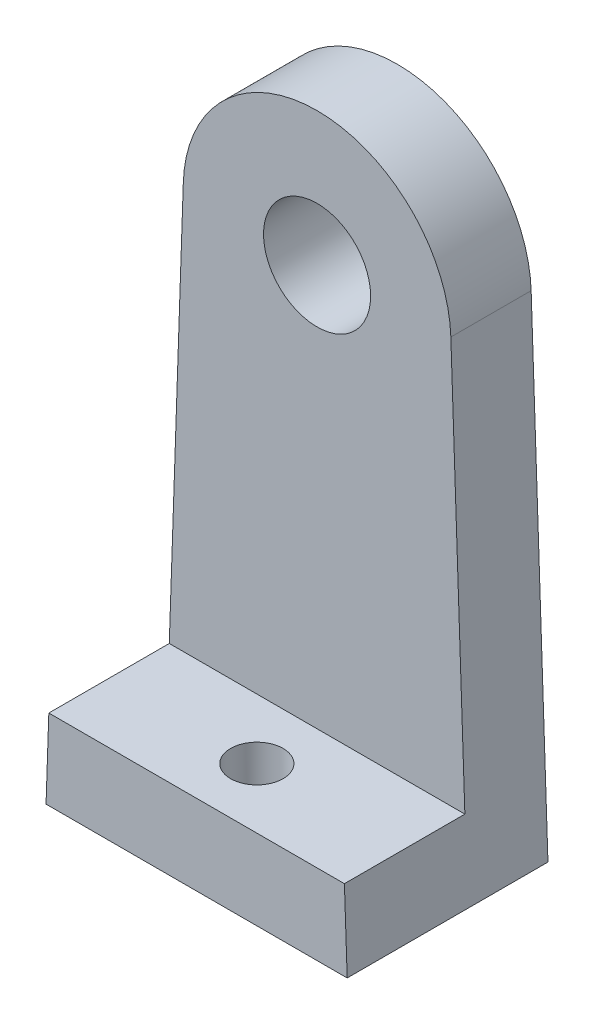
ISO-10303-21;
HEADER;
FILE_DESCRIPTION(('STEP AP214'),'2;1');
FILE_NAME('part.step','',(''),(''),'','','');
FILE_SCHEMA(('AUTOMOTIVE_DESIGN { 1 0 10303 214 1 1 1 1 }'));
ENDSEC;
DATA;
#1=APPLICATION_CONTEXT('core data for automotive mechanical design processes');
#2=APPLICATION_PROTOCOL_DEFINITION('international standard','automotive_design',2000,#1);
#3=PRODUCT_CONTEXT('',#1,'mechanical');
#4=PRODUCT('Part','Part','',(#3));
#5=PRODUCT_RELATED_PRODUCT_CATEGORY('part','',(#4));
#6=PRODUCT_DEFINITION_FORMATION('','',#4);
#7=PRODUCT_DEFINITION_CONTEXT('part definition',#1,'design');
#8=PRODUCT_DEFINITION('design','',#6,#7);
#9=PRODUCT_DEFINITION_SHAPE('','',#8);
#10=(LENGTH_UNIT() NAMED_UNIT(*) SI_UNIT(.MILLI.,.METRE.));
#11=(NAMED_UNIT(*) PLANE_ANGLE_UNIT() SI_UNIT($,.RADIAN.));
#12=(NAMED_UNIT(*) SI_UNIT($,.STERADIAN.) SOLID_ANGLE_UNIT());
#13=UNCERTAINTY_MEASURE_WITH_UNIT(LENGTH_MEASURE(1.E-05),#10,'distance_accuracy_value','');
#14=(GEOMETRIC_REPRESENTATION_CONTEXT(3) GLOBAL_UNCERTAINTY_ASSIGNED_CONTEXT((#13)) GLOBAL_UNIT_ASSIGNED_CONTEXT((#10,
#11,#12)) REPRESENTATION_CONTEXT('',''));
#15=CARTESIAN_POINT('',(0.,0.,0.));
#16=DIRECTION('',(0.,0.,1.));
#17=DIRECTION('',(1.,0.,0.));
#18=AXIS2_PLACEMENT_3D('',#15,#16,#17);
#19=CARTESIAN_POINT('',(-12.6924239572028,46.1586047088481,3.81));
#20=DIRECTION('',(0.999403461197073,-0.0345358038463075,0.));
#21=DIRECTION('',(0.0345358038463075,0.999403461197073,0.));
#22=AXIS2_PLACEMENT_3D('',#19,#20,#21);
#23=PLANE('',#22);
#24=DIRECTION('',(-0.0345358038463075,-0.999403461197073,0.));
#25=VECTOR('',#24,1.);
#26=CARTESIAN_POINT('',(-12.6924239572028,46.1586047088481,-3.81));
#27=LINE('',#26,#25);
#28=CARTESIAN_POINT('',(-12.6924239572028,46.1586047088481,-3.81));
#29=VERTEX_POINT('',#28);
#30=CARTESIAN_POINT('',(-14.2875,0.,-3.81));
#31=VERTEX_POINT('',#30);
#32=EDGE_CURVE('E98',#29,#31,#27,.T.);
#33=ORIENTED_EDGE('',*,*,#32,.T.);
#34=DIRECTION('',(0.,0.,-1.));
#35=VECTOR('',#34,1.);
#36=CARTESIAN_POINT('',(-14.2875,0.,3.81));
#37=LINE('',#36,#35);
#38=CARTESIAN_POINT('',(-14.2875,0.,15.24));
#39=VERTEX_POINT('',#38);
#40=EDGE_CURVE('E11',#39,#31,#37,.T.);
#41=ORIENTED_EDGE('',*,*,#40,.F.);
#42=DIRECTION('',(-0.0345358038463076,-0.999403461197073,0.));
#43=VECTOR('',#42,1.);
#44=CARTESIAN_POINT('',(-14.0241800941497,7.62,15.24));
#45=LINE('',#44,#43);
#46=CARTESIAN_POINT('',(-14.0241800941497,7.62,15.24));
#47=VERTEX_POINT('',#46);
#48=EDGE_CURVE('E129',#47,#39,#45,.T.);
#49=ORIENTED_EDGE('',*,*,#48,.F.);
#50=DIRECTION('',(0.,0.,-1.));
#51=VECTOR('',#50,1.);
#52=CARTESIAN_POINT('',(-14.0241800941497,7.62,15.24));
#53=LINE('',#52,#51);
#54=CARTESIAN_POINT('',(-14.0241800941497,7.62,3.81));
#55=VERTEX_POINT('',#54);
#56=EDGE_CURVE('E110',#47,#55,#53,.T.);
#57=ORIENTED_EDGE('',*,*,#56,.T.);
#58=DIRECTION('',(-0.0345358038463075,-0.999403461197073,0.));
#59=VECTOR('',#58,1.);
#60=CARTESIAN_POINT('',(-12.6924239572028,46.1586047088481,3.81));
#61=LINE('',#60,#59);
#62=CARTESIAN_POINT('',(-12.6924239572028,46.1586047088481,3.81));
#63=VERTEX_POINT('',#62);
#64=EDGE_CURVE('E95',#63,#55,#61,.T.);
#65=ORIENTED_EDGE('',*,*,#64,.F.);
#66=DIRECTION('',(0.,0.,-1.));
#67=VECTOR('',#66,1.);
#68=CARTESIAN_POINT('',(-12.6924239572028,46.1586047088481,3.81));
#69=LINE('',#68,#67);
#70=EDGE_CURVE('E84',#63,#29,#69,.T.);
#71=ORIENTED_EDGE('',*,*,#70,.T.);
#72=EDGE_LOOP('',(#33,#41,#49,#57,#65,#71));
#73=FACE_BOUND('',#72,.T.);
#74=ADVANCED_FACE('F41',(#73),#23,.F.);
#75=CARTESIAN_POINT('',(-14.2875,0.,3.81));
#76=DIRECTION('',(0.,1.,0.));
#77=DIRECTION('',(0.,0.,1.));
#78=AXIS2_PLACEMENT_3D('',#75,#76,#77);
#79=PLANE('',#78);
#80=CARTESIAN_POINT('',(0.,0.,9.525));
#81=DIRECTION('',(0.,1.,0.));
#82=DIRECTION('',(0.,0.,1.));
#83=AXIS2_PLACEMENT_3D('',#80,#81,#82);
#84=CIRCLE('',#83,2.4892);
#85=CARTESIAN_POINT('',(0.,0.,12.0142));
#86=VERTEX_POINT('',#85);
#87=EDGE_CURVE('E117',#86,#86,#84,.T.);
#88=ORIENTED_EDGE('',*,*,#87,.T.);
#89=EDGE_LOOP('',(#88));
#90=FACE_BOUND('',#89,.T.);
#91=DIRECTION('',(1.,0.,0.));
#92=VECTOR('',#91,1.);
#93=CARTESIAN_POINT('',(-14.2875,0.,-3.81));
#94=LINE('',#93,#92);
#95=CARTESIAN_POINT('',(14.2875,0.,-3.81));
#96=VERTEX_POINT('',#95);
#97=EDGE_CURVE('E105',#31,#96,#94,.T.);
#98=ORIENTED_EDGE('',*,*,#97,.T.);
#99=DIRECTION('',(0.,0.,-1.));
#100=VECTOR('',#99,1.);
#101=CARTESIAN_POINT('',(14.2875,0.,3.81));
#102=LINE('',#101,#100);
#103=CARTESIAN_POINT('',(14.2875,0.,15.24));
#104=VERTEX_POINT('',#103);
#105=EDGE_CURVE('E47',#104,#96,#102,.T.);
#106=ORIENTED_EDGE('',*,*,#105,.F.);
#107=DIRECTION('',(1.,0.,0.));
#108=VECTOR('',#107,1.);
#109=CARTESIAN_POINT('',(-14.2875,0.,15.24));
#110=LINE('',#109,#108);
#111=EDGE_CURVE('E134',#39,#104,#110,.T.);
#112=ORIENTED_EDGE('',*,*,#111,.F.);
#113=ORIENTED_EDGE('',*,*,#40,.T.);
#114=EDGE_LOOP('',(#98,#106,#112,#113));
#115=FACE_BOUND('',#114,.T.);
#116=ADVANCED_FACE('F153',(#90,#115),#79,.F.);
#117=CARTESIAN_POINT('',(14.2875,0.,3.81));
#118=DIRECTION('',(-0.999403461197073,-0.0345358038463075,0.));
#119=DIRECTION('',(0.0345358038463075,-0.999403461197073,0.));
#120=AXIS2_PLACEMENT_3D('',#117,#118,#119);
#121=PLANE('',#120);
#122=DIRECTION('',(-0.0345358038463075,0.999403461197073,0.));
#123=VECTOR('',#122,1.);
#124=CARTESIAN_POINT('',(14.2875,0.,-3.81));
#125=LINE('',#124,#123);
#126=CARTESIAN_POINT('',(12.6924239572028,46.1586047088481,-3.81));
#127=VERTEX_POINT('',#126);
#128=EDGE_CURVE('E91',#96,#127,#125,.T.);
#129=ORIENTED_EDGE('',*,*,#128,.T.);
#130=DIRECTION('',(0.,0.,-1.));
#131=VECTOR('',#130,1.);
#132=CARTESIAN_POINT('',(12.6924239572028,46.1586047088481,3.81));
#133=LINE('',#132,#131);
#134=CARTESIAN_POINT('',(12.6924239572028,46.1586047088481,3.81));
#135=VERTEX_POINT('',#134);
#136=EDGE_CURVE('E86',#135,#127,#133,.T.);
#137=ORIENTED_EDGE('',*,*,#136,.F.);
#138=DIRECTION('',(-0.0345358038463075,0.999403461197073,0.));
#139=VECTOR('',#138,1.);
#140=CARTESIAN_POINT('',(14.2875,0.,3.81));
#141=LINE('',#140,#139);
#142=CARTESIAN_POINT('',(14.0241800941497,7.62,3.81));
#143=VERTEX_POINT('',#142);
#144=EDGE_CURVE('E141',#143,#135,#141,.T.);
#145=ORIENTED_EDGE('',*,*,#144,.F.);
#146=DIRECTION('',(0.,0.,-1.));
#147=VECTOR('',#146,1.);
#148=CARTESIAN_POINT('',(14.0241800941497,7.62,15.24));
#149=LINE('',#148,#147);
#150=CARTESIAN_POINT('',(14.0241800941497,7.62,15.24));
#151=VERTEX_POINT('',#150);
#152=EDGE_CURVE('E103',#151,#143,#149,.T.);
#153=ORIENTED_EDGE('',*,*,#152,.F.);
#154=DIRECTION('',(-0.0345358038463076,0.999403461197073,0.));
#155=VECTOR('',#154,1.);
#156=CARTESIAN_POINT('',(14.2875,0.,15.24));
#157=LINE('',#156,#155);
#158=EDGE_CURVE('E131',#104,#151,#157,.T.);
#159=ORIENTED_EDGE('',*,*,#158,.F.);
#160=ORIENTED_EDGE('',*,*,#105,.T.);
#161=EDGE_LOOP('',(#129,#137,#145,#153,#159,#160));
#162=FACE_BOUND('',#161,.T.);
#163=ADVANCED_FACE('F150',(#162),#121,.F.);
#164=CARTESIAN_POINT('',(0.,45.72,3.81));
#165=DIRECTION('',(0.,0.,-1.));
#166=DIRECTION('',(-1.,0.,0.));
#167=AXIS2_PLACEMENT_3D('',#164,#165,#166);
#168=CYLINDRICAL_SURFACE('',#167,12.7);
#169=CARTESIAN_POINT('',(0.,45.72,-3.81));
#170=DIRECTION('',(0.,0.,1.));
#171=DIRECTION('',(1.,0.,0.));
#172=AXIS2_PLACEMENT_3D('',#169,#170,#171);
#173=CIRCLE('',#172,12.7);
#174=EDGE_CURVE('E85',#127,#29,#173,.T.);
#175=ORIENTED_EDGE('',*,*,#174,.T.);
#176=ORIENTED_EDGE('',*,*,#70,.F.);
#177=CARTESIAN_POINT('',(0.,45.72,3.81));
#178=DIRECTION('',(0.,0.,1.));
#179=DIRECTION('',(1.,0.,0.));
#180=AXIS2_PLACEMENT_3D('',#177,#178,#179);
#181=CIRCLE('',#180,12.7);
#182=EDGE_CURVE('E62',#135,#63,#181,.T.);
#183=ORIENTED_EDGE('',*,*,#182,.F.);
#184=ORIENTED_EDGE('',*,*,#136,.T.);
#185=EDGE_LOOP('',(#175,#176,#183,#184));
#186=FACE_BOUND('',#185,.T.);
#187=ADVANCED_FACE('F83',(#186),#168,.T.);
#188=CARTESIAN_POINT('',(0.,45.72,3.81));
#189=DIRECTION('',(0.,0.,1.));
#190=DIRECTION('',(1.,0.,0.));
#191=AXIS2_PLACEMENT_3D('',#188,#189,#190);
#192=PLANE('',#191);
#193=CARTESIAN_POINT('',(0.,45.72,3.81));
#194=DIRECTION('',(0.,0.,1.));
#195=DIRECTION('',(1.,0.,0.));
#196=AXIS2_PLACEMENT_3D('',#193,#194,#195);
#197=CIRCLE('',#196,5.08);
#198=CARTESIAN_POINT('',(5.08,45.72,3.81));
#199=VERTEX_POINT('',#198);
#200=EDGE_CURVE('E119',#199,#199,#197,.T.);
#201=ORIENTED_EDGE('',*,*,#200,.F.);
#202=EDGE_LOOP('',(#201));
#203=FACE_BOUND('',#202,.T.);
#204=DIRECTION('',(-1.,0.,0.));
#205=VECTOR('',#204,1.);
#206=CARTESIAN_POINT('',(14.0241800941497,7.62,3.81));
#207=LINE('',#206,#205);
#208=EDGE_CURVE('E60',#143,#55,#207,.T.);
#209=ORIENTED_EDGE('',*,*,#208,.F.);
#210=ORIENTED_EDGE('',*,*,#144,.T.);
#211=ORIENTED_EDGE('',*,*,#182,.T.);
#212=ORIENTED_EDGE('',*,*,#64,.T.);
#213=EDGE_LOOP('',(#209,#210,#211,#212));
#214=FACE_BOUND('',#213,.T.);
#215=ADVANCED_FACE('F145',(#203,#214),#192,.T.);
#216=CARTESIAN_POINT('',(0.,45.72,-3.81));
#217=DIRECTION('',(0.,0.,1.));
#218=DIRECTION('',(1.,0.,0.));
#219=AXIS2_PLACEMENT_3D('',#216,#217,#218);
#220=PLANE('',#219);
#221=CARTESIAN_POINT('',(0.,45.72,-3.81));
#222=DIRECTION('',(0.,0.,1.));
#223=DIRECTION('',(1.,0.,0.));
#224=AXIS2_PLACEMENT_3D('',#221,#222,#223);
#225=CIRCLE('',#224,5.08);
#226=CARTESIAN_POINT('',(5.08,45.72,-3.81));
#227=VERTEX_POINT('',#226);
#228=EDGE_CURVE('E113',#227,#227,#225,.T.);
#229=ORIENTED_EDGE('',*,*,#228,.T.);
#230=EDGE_LOOP('',(#229));
#231=FACE_BOUND('',#230,.T.);
#232=ORIENTED_EDGE('',*,*,#32,.F.);
#233=ORIENTED_EDGE('',*,*,#174,.F.);
#234=ORIENTED_EDGE('',*,*,#128,.F.);
#235=ORIENTED_EDGE('',*,*,#97,.F.);
#236=EDGE_LOOP('',(#232,#233,#234,#235));
#237=FACE_BOUND('',#236,.T.);
#238=ADVANCED_FACE('F101',(#231,#237),#220,.F.);
#239=CARTESIAN_POINT('',(14.0241800941497,7.62,15.24));
#240=DIRECTION('',(0.,-1.,0.));
#241=DIRECTION('',(0.,0.,-1.));
#242=AXIS2_PLACEMENT_3D('',#239,#240,#241);
#243=PLANE('',#242);
#244=CARTESIAN_POINT('',(0.,7.62,9.525));
#245=DIRECTION('',(0.,-1.,0.));
#246=DIRECTION('',(0.,0.,-1.));
#247=AXIS2_PLACEMENT_3D('',#244,#245,#246);
#248=CIRCLE('',#247,2.4892);
#249=CARTESIAN_POINT('',(0.,7.62,7.0358));
#250=VERTEX_POINT('',#249);
#251=EDGE_CURVE('E42',#250,#250,#248,.T.);
#252=ORIENTED_EDGE('',*,*,#251,.T.);
#253=EDGE_LOOP('',(#252));
#254=FACE_BOUND('',#253,.T.);
#255=ORIENTED_EDGE('',*,*,#208,.T.);
#256=ORIENTED_EDGE('',*,*,#56,.F.);
#257=DIRECTION('',(-1.,0.,0.));
#258=VECTOR('',#257,1.);
#259=CARTESIAN_POINT('',(14.0241800941497,7.62,15.24));
#260=LINE('',#259,#258);
#261=EDGE_CURVE('E137',#151,#47,#260,.T.);
#262=ORIENTED_EDGE('',*,*,#261,.F.);
#263=ORIENTED_EDGE('',*,*,#152,.T.);
#264=EDGE_LOOP('',(#255,#256,#262,#263));
#265=FACE_BOUND('',#264,.T.);
#266=ADVANCED_FACE('F170',(#254,#265),#243,.F.);
#267=CARTESIAN_POINT('',(0.,0.,15.24));
#268=DIRECTION('',(0.,0.,1.));
#269=DIRECTION('',(1.,0.,0.));
#270=AXIS2_PLACEMENT_3D('',#267,#268,#269);
#271=PLANE('',#270);
#272=ORIENTED_EDGE('',*,*,#48,.T.);
#273=ORIENTED_EDGE('',*,*,#111,.T.);
#274=ORIENTED_EDGE('',*,*,#158,.T.);
#275=ORIENTED_EDGE('',*,*,#261,.T.);
#276=EDGE_LOOP('',(#272,#273,#274,#275));
#277=FACE_BOUND('',#276,.T.);
#278=ADVANCED_FACE('F158',(#277),#271,.T.);
#279=CARTESIAN_POINT('',(0.,45.72,-20.));
#280=DIRECTION('',(0.,0.,1.));
#281=DIRECTION('',(1.,0.,0.));
#282=AXIS2_PLACEMENT_3D('',#279,#280,#281);
#283=CYLINDRICAL_SURFACE('',#282,5.08);
#284=ORIENTED_EDGE('',*,*,#200,.T.);
#285=EDGE_LOOP('',(#284));
#286=FACE_BOUND('',#285,.T.);
#287=ORIENTED_EDGE('',*,*,#228,.F.);
#288=EDGE_LOOP('',(#287));
#289=FACE_BOUND('',#288,.T.);
#290=ADVANCED_FACE('F176',(#286,#289),#283,.F.);
#291=CARTESIAN_POINT('',(0.,-20.,9.525));
#292=DIRECTION('',(0.,1.,0.));
#293=DIRECTION('',(0.,0.,1.));
#294=AXIS2_PLACEMENT_3D('',#291,#292,#293);
#295=CYLINDRICAL_SURFACE('',#294,2.4892);
#296=ORIENTED_EDGE('',*,*,#251,.F.);
#297=EDGE_LOOP('',(#296));
#298=FACE_BOUND('',#297,.T.);
#299=ORIENTED_EDGE('',*,*,#87,.F.);
#300=EDGE_LOOP('',(#299));
#301=FACE_BOUND('',#300,.T.);
#302=ADVANCED_FACE('F196',(#298,#301),#295,.F.);
#303=CLOSED_SHELL('',(#74,#116,#163,#187,#215,#238,#266,#278,#290,#302));
#304=MANIFOLD_SOLID_BREP('B2',#303);
#305=ADVANCED_BREP_SHAPE_REPRESENTATION('',(#18,#304),#14);
#306=SHAPE_DEFINITION_REPRESENTATION(#9,#305);
ENDSEC;
END-ISO-10303-21;
